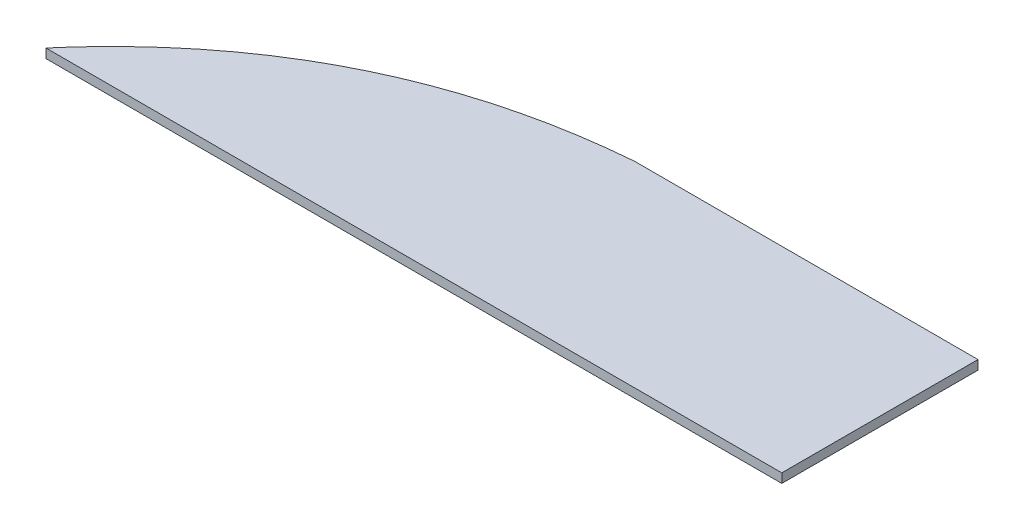
ISO-10303-21;
HEADER;
FILE_DESCRIPTION(('STEP AP214'),'2;1');
FILE_NAME('part.step','',(''),(''),'','','');
FILE_SCHEMA(('AUTOMOTIVE_DESIGN { 1 0 10303 214 1 1 1 1 }'));
ENDSEC;
DATA;
#1=APPLICATION_CONTEXT('core data for automotive mechanical design processes');
#2=APPLICATION_PROTOCOL_DEFINITION('international standard','automotive_design',2000,#1);
#3=PRODUCT_CONTEXT('',#1,'mechanical');
#4=PRODUCT('Part','Part','',(#3));
#5=PRODUCT_RELATED_PRODUCT_CATEGORY('part','',(#4));
#6=PRODUCT_DEFINITION_FORMATION('','',#4);
#7=PRODUCT_DEFINITION_CONTEXT('part definition',#1,'design');
#8=PRODUCT_DEFINITION('design','',#6,#7);
#9=PRODUCT_DEFINITION_SHAPE('','',#8);
#10=(LENGTH_UNIT() NAMED_UNIT(*) SI_UNIT(.MILLI.,.METRE.));
#11=(NAMED_UNIT(*) PLANE_ANGLE_UNIT() SI_UNIT($,.RADIAN.));
#12=(NAMED_UNIT(*) SI_UNIT($,.STERADIAN.) SOLID_ANGLE_UNIT());
#13=UNCERTAINTY_MEASURE_WITH_UNIT(LENGTH_MEASURE(1.E-05),#10,'distance_accuracy_value','');
#14=(GEOMETRIC_REPRESENTATION_CONTEXT(3) GLOBAL_UNCERTAINTY_ASSIGNED_CONTEXT((#13)) GLOBAL_UNIT_ASSIGNED_CONTEXT((#10,
#11,#12)) REPRESENTATION_CONTEXT('',''));
#15=CARTESIAN_POINT('',(0.,0.,0.));
#16=DIRECTION('',(0.,0.,1.));
#17=DIRECTION('',(1.,0.,0.));
#18=AXIS2_PLACEMENT_3D('',#15,#16,#17);
#19=CARTESIAN_POINT('',(0.,4.7625,0.));
#20=DIRECTION('',(0.,0.,-1.));
#21=DIRECTION('',(-1.,0.,0.));
#22=AXIS2_PLACEMENT_3D('',#19,#20,#21);
#23=PLANE('',#22);
#24=DIRECTION('',(1.,0.,0.));
#25=VECTOR('',#24,1.);
#26=CARTESIAN_POINT('',(0.,0.,0.));
#27=LINE('',#26,#25);
#28=CARTESIAN_POINT('',(0.,0.,0.));
#29=VERTEX_POINT('',#28);
#30=CARTESIAN_POINT('',(381.,0.,0.));
#31=VERTEX_POINT('',#30);
#32=EDGE_CURVE('E75',#29,#31,#27,.T.);
#33=ORIENTED_EDGE('',*,*,#32,.T.);
#34=DIRECTION('',(0.,-1.,0.));
#35=VECTOR('',#34,1.);
#36=CARTESIAN_POINT('',(381.,4.7625,0.));
#37=LINE('',#36,#35);
#38=CARTESIAN_POINT('',(381.,4.7625,0.));
#39=VERTEX_POINT('',#38);
#40=EDGE_CURVE('E47',#39,#31,#37,.T.);
#41=ORIENTED_EDGE('',*,*,#40,.F.);
#42=DIRECTION('',(1.,0.,0.));
#43=VECTOR('',#42,1.);
#44=CARTESIAN_POINT('',(0.,4.7625,0.));
#45=LINE('',#44,#43);
#46=CARTESIAN_POINT('',(0.,4.7625,0.));
#47=VERTEX_POINT('',#46);
#48=EDGE_CURVE('E94',#47,#39,#45,.T.);
#49=ORIENTED_EDGE('',*,*,#48,.F.);
#50=DIRECTION('',(0.,-1.,0.));
#51=VECTOR('',#50,1.);
#52=CARTESIAN_POINT('',(0.,4.7625,0.));
#53=LINE('',#52,#51);
#54=EDGE_CURVE('E11',#47,#29,#53,.T.);
#55=ORIENTED_EDGE('',*,*,#54,.T.);
#56=EDGE_LOOP('',(#33,#41,#49,#55));
#57=FACE_BOUND('',#56,.T.);
#58=ADVANCED_FACE('F39',(#57),#23,.F.);
#59=CARTESIAN_POINT('',(381.,4.7625,0.));
#60=DIRECTION('',(-1.,0.,0.));
#61=DIRECTION('',(0.,0.,1.));
#62=AXIS2_PLACEMENT_3D('',#59,#60,#61);
#63=PLANE('',#62);
#64=DIRECTION('',(0.,0.,-1.));
#65=VECTOR('',#64,1.);
#66=CARTESIAN_POINT('',(381.,0.,0.));
#67=LINE('',#66,#65);
#68=CARTESIAN_POINT('',(381.,0.,-101.6));
#69=VERTEX_POINT('',#68);
#70=EDGE_CURVE('E99',#31,#69,#67,.T.);
#71=ORIENTED_EDGE('',*,*,#70,.T.);
#72=DIRECTION('',(0.,-1.,0.));
#73=VECTOR('',#72,1.);
#74=CARTESIAN_POINT('',(381.,4.7625,-101.6));
#75=LINE('',#74,#73);
#76=CARTESIAN_POINT('',(381.,4.7625,-101.6));
#77=VERTEX_POINT('',#76);
#78=EDGE_CURVE('E91',#77,#69,#75,.T.);
#79=ORIENTED_EDGE('',*,*,#78,.F.);
#80=DIRECTION('',(0.,0.,-1.));
#81=VECTOR('',#80,1.);
#82=CARTESIAN_POINT('',(381.,4.7625,0.));
#83=LINE('',#82,#81);
#84=EDGE_CURVE('E89',#39,#77,#83,.T.);
#85=ORIENTED_EDGE('',*,*,#84,.F.);
#86=ORIENTED_EDGE('',*,*,#40,.T.);
#87=EDGE_LOOP('',(#71,#79,#85,#86));
#88=FACE_BOUND('',#87,.T.);
#89=ADVANCED_FACE('F121',(#88),#63,.F.);
#90=CARTESIAN_POINT('',(0.,4.7625,-101.6));
#91=DIRECTION('',(0.,0.,1.));
#92=DIRECTION('',(1.,0.,0.));
#93=AXIS2_PLACEMENT_3D('',#90,#91,#92);
#94=PLANE('',#93);
#95=DIRECTION('',(-1.,0.,0.));
#96=VECTOR('',#95,1.);
#97=CARTESIAN_POINT('',(0.,0.,-101.6));
#98=LINE('',#97,#96);
#99=CARTESIAN_POINT('',(203.2,0.,-101.6));
#100=VERTEX_POINT('',#99);
#101=EDGE_CURVE('E84',#69,#100,#98,.T.);
#102=ORIENTED_EDGE('',*,*,#101,.T.);
#103=DIRECTION('',(0.,1.,0.));
#104=VECTOR('',#103,1.);
#105=CARTESIAN_POINT('',(203.2,0.,-101.6));
#106=LINE('',#105,#104);
#107=CARTESIAN_POINT('',(203.2,4.7625,-101.6));
#108=VERTEX_POINT('',#107);
#109=EDGE_CURVE('E55',#100,#108,#106,.T.);
#110=ORIENTED_EDGE('',*,*,#109,.T.);
#111=DIRECTION('',(-1.,0.,0.));
#112=VECTOR('',#111,1.);
#113=CARTESIAN_POINT('',(0.,4.7625,-101.6));
#114=LINE('',#113,#112);
#115=EDGE_CURVE('E82',#77,#108,#114,.T.);
#116=ORIENTED_EDGE('',*,*,#115,.F.);
#117=ORIENTED_EDGE('',*,*,#78,.T.);
#118=EDGE_LOOP('',(#102,#110,#116,#117));
#119=FACE_BOUND('',#118,.T.);
#120=ADVANCED_FACE('F80',(#119),#94,.F.);
#121=CARTESIAN_POINT('',(0.,4.7625,0.));
#122=DIRECTION('',(0.,-1.,0.));
#123=DIRECTION('',(0.,0.,-1.));
#124=AXIS2_PLACEMENT_3D('',#121,#122,#123);
#125=PLANE('',#124);
#126=ORIENTED_EDGE('',*,*,#115,.T.);
#127=CARTESIAN_POINT('',(203.2,4.7625,-101.6));
#128=CARTESIAN_POINT('',(78.2793476723577,4.7625,-91.4911518700574));
#129=CARTESIAN_POINT('',(0.,4.7625,0.));
#130=B_SPLINE_CURVE_WITH_KNOTS('',2,(#127,#128,#129),.UNSPECIFIED.,.F.,.F.,(3,3),(0.,1.),.UNSPECIFIED.);
#131=EDGE_CURVE('E69',#47,#108,#130,.F.);
#132=ORIENTED_EDGE('',*,*,#131,.F.);
#133=ORIENTED_EDGE('',*,*,#48,.T.);
#134=ORIENTED_EDGE('',*,*,#84,.T.);
#135=EDGE_LOOP('',(#126,#132,#133,#134));
#136=FACE_BOUND('',#135,.T.);
#137=ADVANCED_FACE('F87',(#136),#125,.F.);
#138=CARTESIAN_POINT('',(0.,0.,0.));
#139=DIRECTION('',(0.,-1.,0.));
#140=DIRECTION('',(0.,0.,-1.));
#141=AXIS2_PLACEMENT_3D('',#138,#139,#140);
#142=PLANE('',#141);
#143=CARTESIAN_POINT('',(0.,0.,0.));
#144=CARTESIAN_POINT('',(78.2793476723577,0.,-91.4911518700574));
#145=CARTESIAN_POINT('',(203.2,0.,-101.6));
#146=B_SPLINE_CURVE_WITH_KNOTS('',2,(#143,#144,#145),.UNSPECIFIED.,.F.,.F.,(3,3),(0.,1.),.UNSPECIFIED.);
#147=EDGE_CURVE('E85',#29,#100,#146,.T.);
#148=ORIENTED_EDGE('',*,*,#147,.T.);
#149=ORIENTED_EDGE('',*,*,#101,.F.);
#150=ORIENTED_EDGE('',*,*,#70,.F.);
#151=ORIENTED_EDGE('',*,*,#32,.F.);
#152=EDGE_LOOP('',(#148,#149,#150,#151));
#153=FACE_BOUND('',#152,.T.);
#154=ADVANCED_FACE('F115',(#153),#142,.T.);
#155=DIRECTION('',(0.,1.,0.));
#156=VECTOR('',#155,1.);
#157=SURFACE_OF_LINEAR_EXTRUSION('',#146,#156);
#158=ORIENTED_EDGE('',*,*,#109,.F.);
#159=ORIENTED_EDGE('',*,*,#147,.F.);
#160=ORIENTED_EDGE('',*,*,#54,.F.);
#161=ORIENTED_EDGE('',*,*,#131,.T.);
#162=EDGE_LOOP('',(#158,#159,#160,#161));
#163=FACE_BOUND('',#162,.T.);
#164=ADVANCED_FACE('F70',(#163),#157,.F.);
#165=CLOSED_SHELL('',(#58,#89,#120,#137,#154,#164));
#166=MANIFOLD_SOLID_BREP('B2',#165);
#167=ADVANCED_BREP_SHAPE_REPRESENTATION('',(#18,#166),#14);
#168=SHAPE_DEFINITION_REPRESENTATION(#9,#167);
ENDSEC;
END-ISO-10303-21;
